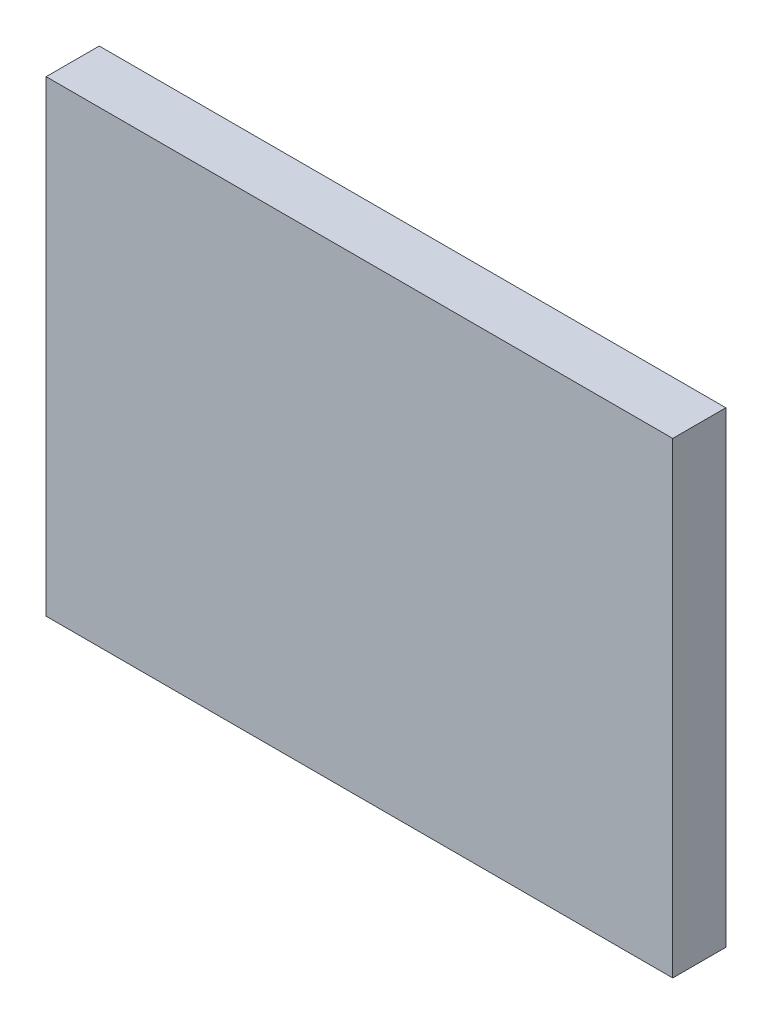
ISO-10303-21;
HEADER;
FILE_DESCRIPTION(('STEP AP214'),'2;1');
FILE_NAME('part.step','',(''),(''),'','','');
FILE_SCHEMA(('AUTOMOTIVE_DESIGN { 1 0 10303 214 1 1 1 1 }'));
ENDSEC;
DATA;
#1=APPLICATION_CONTEXT('core data for automotive mechanical design processes');
#2=APPLICATION_PROTOCOL_DEFINITION('international standard','automotive_design',2000,#1);
#3=PRODUCT_CONTEXT('',#1,'mechanical');
#4=PRODUCT('Part','Part','',(#3));
#5=PRODUCT_RELATED_PRODUCT_CATEGORY('part','',(#4));
#6=PRODUCT_DEFINITION_FORMATION('','',#4);
#7=PRODUCT_DEFINITION_CONTEXT('part definition',#1,'design');
#8=PRODUCT_DEFINITION('design','',#6,#7);
#9=PRODUCT_DEFINITION_SHAPE('','',#8);
#10=(LENGTH_UNIT() NAMED_UNIT(*) SI_UNIT(.MILLI.,.METRE.));
#11=(NAMED_UNIT(*) PLANE_ANGLE_UNIT() SI_UNIT($,.RADIAN.));
#12=(NAMED_UNIT(*) SI_UNIT($,.STERADIAN.) SOLID_ANGLE_UNIT());
#13=UNCERTAINTY_MEASURE_WITH_UNIT(LENGTH_MEASURE(1.E-05),#10,'distance_accuracy_value','');
#14=(GEOMETRIC_REPRESENTATION_CONTEXT(3) GLOBAL_UNCERTAINTY_ASSIGNED_CONTEXT((#13)) GLOBAL_UNIT_ASSIGNED_CONTEXT((#10,
#11,#12)) REPRESENTATION_CONTEXT('',''));
#15=CARTESIAN_POINT('',(0.,0.,0.));
#16=DIRECTION('',(0.,0.,1.));
#17=DIRECTION('',(1.,0.,0.));
#18=AXIS2_PLACEMENT_3D('',#15,#16,#17);
#19=CARTESIAN_POINT('',(-29.5,-22.,5.));
#20=DIRECTION('',(1.,0.,0.));
#21=DIRECTION('',(0.,0.,-1.));
#22=AXIS2_PLACEMENT_3D('',#19,#20,#21);
#23=PLANE('',#22);
#24=DIRECTION('',(0.,-1.,0.));
#25=VECTOR('',#24,1.);
#26=CARTESIAN_POINT('',(-29.5,-22.,0.));
#27=LINE('',#26,#25);
#28=CARTESIAN_POINT('',(-29.5,22.,0.));
#29=VERTEX_POINT('',#28);
#30=CARTESIAN_POINT('',(-29.5,-22.,0.));
#31=VERTEX_POINT('',#30);
#32=EDGE_CURVE('E99',#29,#31,#27,.T.);
#33=ORIENTED_EDGE('',*,*,#32,.T.);
#34=DIRECTION('',(0.,0.,-1.));
#35=VECTOR('',#34,1.);
#36=CARTESIAN_POINT('',(-29.5,-22.,5.));
#37=LINE('',#36,#35);
#38=CARTESIAN_POINT('',(-29.5,-22.,5.));
#39=VERTEX_POINT('',#38);
#40=EDGE_CURVE('E11',#39,#31,#37,.T.);
#41=ORIENTED_EDGE('',*,*,#40,.F.);
#42=DIRECTION('',(0.,-1.,0.));
#43=VECTOR('',#42,1.);
#44=CARTESIAN_POINT('',(-29.5,-22.,5.));
#45=LINE('',#44,#43);
#46=CARTESIAN_POINT('',(-29.5,22.,5.));
#47=VERTEX_POINT('',#46);
#48=EDGE_CURVE('E87',#47,#39,#45,.T.);
#49=ORIENTED_EDGE('',*,*,#48,.F.);
#50=DIRECTION('',(0.,0.,-1.));
#51=VECTOR('',#50,1.);
#52=CARTESIAN_POINT('',(-29.5,22.,5.));
#53=LINE('',#52,#51);
#54=EDGE_CURVE('E95',#47,#29,#53,.T.);
#55=ORIENTED_EDGE('',*,*,#54,.T.);
#56=EDGE_LOOP('',(#33,#41,#49,#55));
#57=FACE_BOUND('',#56,.T.);
#58=ADVANCED_FACE('F36',(#57),#23,.F.);
#59=CARTESIAN_POINT('',(29.5,-22.,5.));
#60=DIRECTION('',(0.,1.,0.));
#61=DIRECTION('',(-1.,0.,0.));
#62=AXIS2_PLACEMENT_3D('',#59,#60,#61);
#63=PLANE('',#62);
#64=DIRECTION('',(1.,0.,0.));
#65=VECTOR('',#64,1.);
#66=CARTESIAN_POINT('',(29.5,-22.,0.));
#67=LINE('',#66,#65);
#68=CARTESIAN_POINT('',(29.5,-22.,0.));
#69=VERTEX_POINT('',#68);
#70=EDGE_CURVE('E91',#31,#69,#67,.T.);
#71=ORIENTED_EDGE('',*,*,#70,.T.);
#72=DIRECTION('',(0.,0.,-1.));
#73=VECTOR('',#72,1.);
#74=CARTESIAN_POINT('',(29.5,-22.,5.));
#75=LINE('',#74,#73);
#76=CARTESIAN_POINT('',(29.5,-22.,5.));
#77=VERTEX_POINT('',#76);
#78=EDGE_CURVE('E44',#77,#69,#75,.T.);
#79=ORIENTED_EDGE('',*,*,#78,.F.);
#80=DIRECTION('',(1.,0.,0.));
#81=VECTOR('',#80,1.);
#82=CARTESIAN_POINT('',(29.5,-22.,5.));
#83=LINE('',#82,#81);
#84=EDGE_CURVE('E82',#39,#77,#83,.T.);
#85=ORIENTED_EDGE('',*,*,#84,.F.);
#86=ORIENTED_EDGE('',*,*,#40,.T.);
#87=EDGE_LOOP('',(#71,#79,#85,#86));
#88=FACE_BOUND('',#87,.T.);
#89=ADVANCED_FACE('F90',(#88),#63,.F.);
#90=CARTESIAN_POINT('',(29.5,-22.,5.));
#91=DIRECTION('',(-1.,0.,0.));
#92=DIRECTION('',(0.,0.,1.));
#93=AXIS2_PLACEMENT_3D('',#90,#91,#92);
#94=PLANE('',#93);
#95=DIRECTION('',(0.,1.,0.));
#96=VECTOR('',#95,1.);
#97=CARTESIAN_POINT('',(29.5,-22.,0.));
#98=LINE('',#97,#96);
#99=CARTESIAN_POINT('',(29.5,22.,0.));
#100=VERTEX_POINT('',#99);
#101=EDGE_CURVE('E69',#69,#100,#98,.T.);
#102=ORIENTED_EDGE('',*,*,#101,.T.);
#103=DIRECTION('',(0.,0.,-1.));
#104=VECTOR('',#103,1.);
#105=CARTESIAN_POINT('',(29.5,22.,5.));
#106=LINE('',#105,#104);
#107=CARTESIAN_POINT('',(29.5,22.,5.));
#108=VERTEX_POINT('',#107);
#109=EDGE_CURVE('E92',#108,#100,#106,.T.);
#110=ORIENTED_EDGE('',*,*,#109,.F.);
#111=DIRECTION('',(0.,1.,0.));
#112=VECTOR('',#111,1.);
#113=CARTESIAN_POINT('',(29.5,-22.,5.));
#114=LINE('',#113,#112);
#115=EDGE_CURVE('E85',#77,#108,#114,.T.);
#116=ORIENTED_EDGE('',*,*,#115,.F.);
#117=ORIENTED_EDGE('',*,*,#78,.T.);
#118=EDGE_LOOP('',(#102,#110,#116,#117));
#119=FACE_BOUND('',#118,.T.);
#120=ADVANCED_FACE('F93',(#119),#94,.F.);
#121=CARTESIAN_POINT('',(29.5,22.,5.));
#122=DIRECTION('',(0.,-1.,0.));
#123=DIRECTION('',(1.,0.,0.));
#124=AXIS2_PLACEMENT_3D('',#121,#122,#123);
#125=PLANE('',#124);
#126=DIRECTION('',(-1.,0.,0.));
#127=VECTOR('',#126,1.);
#128=CARTESIAN_POINT('',(29.5,22.,0.));
#129=LINE('',#128,#127);
#130=EDGE_CURVE('E75',#100,#29,#129,.T.);
#131=ORIENTED_EDGE('',*,*,#130,.T.);
#132=ORIENTED_EDGE('',*,*,#54,.F.);
#133=DIRECTION('',(-1.,0.,0.));
#134=VECTOR('',#133,1.);
#135=CARTESIAN_POINT('',(29.5,22.,5.));
#136=LINE('',#135,#134);
#137=EDGE_CURVE('E52',#108,#47,#136,.T.);
#138=ORIENTED_EDGE('',*,*,#137,.F.);
#139=ORIENTED_EDGE('',*,*,#109,.T.);
#140=EDGE_LOOP('',(#131,#132,#138,#139));
#141=FACE_BOUND('',#140,.T.);
#142=ADVANCED_FACE('F106',(#141),#125,.F.);
#143=CARTESIAN_POINT('',(0.,0.,5.));
#144=DIRECTION('',(0.,0.,1.));
#145=DIRECTION('',(1.,0.,0.));
#146=AXIS2_PLACEMENT_3D('',#143,#144,#145);
#147=PLANE('',#146);
#148=ORIENTED_EDGE('',*,*,#48,.T.);
#149=ORIENTED_EDGE('',*,*,#84,.T.);
#150=ORIENTED_EDGE('',*,*,#115,.T.);
#151=ORIENTED_EDGE('',*,*,#137,.T.);
#152=EDGE_LOOP('',(#148,#149,#150,#151));
#153=FACE_BOUND('',#152,.T.);
#154=ADVANCED_FACE('F83',(#153),#147,.T.);
#155=CARTESIAN_POINT('',(0.,0.,0.));
#156=DIRECTION('',(0.,0.,1.));
#157=DIRECTION('',(1.,0.,0.));
#158=AXIS2_PLACEMENT_3D('',#155,#156,#157);
#159=PLANE('',#158);
#160=ORIENTED_EDGE('',*,*,#32,.F.);
#161=ORIENTED_EDGE('',*,*,#130,.F.);
#162=ORIENTED_EDGE('',*,*,#101,.F.);
#163=ORIENTED_EDGE('',*,*,#70,.F.);
#164=EDGE_LOOP('',(#160,#161,#162,#163));
#165=FACE_BOUND('',#164,.T.);
#166=ADVANCED_FACE('F109',(#165),#159,.F.);
#167=CLOSED_SHELL('',(#58,#89,#120,#142,#154,#166));
#168=MANIFOLD_SOLID_BREP('B2',#167);
#169=ADVANCED_BREP_SHAPE_REPRESENTATION('',(#18,#168),#14);
#170=SHAPE_DEFINITION_REPRESENTATION(#9,#169);
ENDSEC;
END-ISO-10303-21;
